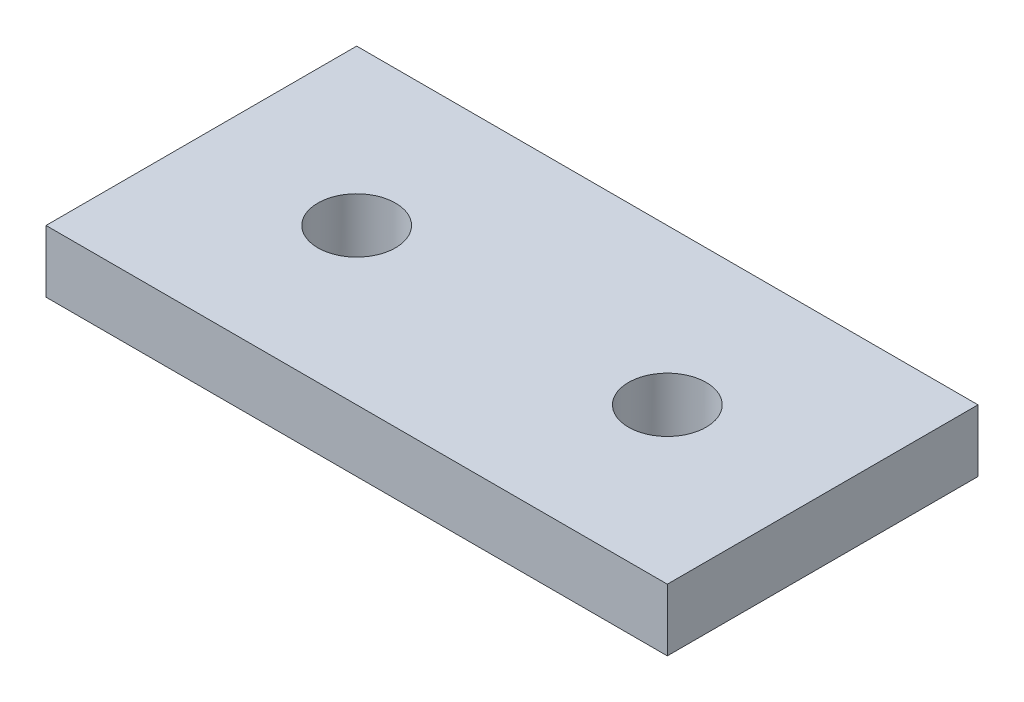
ISO-10303-21;
HEADER;
FILE_DESCRIPTION(('STEP AP214'),'2;1');
FILE_NAME('part.step','',(''),(''),'','','');
FILE_SCHEMA(('AUTOMOTIVE_DESIGN { 1 0 10303 214 1 1 1 1 }'));
ENDSEC;
DATA;
#1=APPLICATION_CONTEXT('core data for automotive mechanical design processes');
#2=APPLICATION_PROTOCOL_DEFINITION('international standard','automotive_design',2000,#1);
#3=PRODUCT_CONTEXT('',#1,'mechanical');
#4=PRODUCT('Part','Part','',(#3));
#5=PRODUCT_RELATED_PRODUCT_CATEGORY('part','',(#4));
#6=PRODUCT_DEFINITION_FORMATION('','',#4);
#7=PRODUCT_DEFINITION_CONTEXT('part definition',#1,'design');
#8=PRODUCT_DEFINITION('design','',#6,#7);
#9=PRODUCT_DEFINITION_SHAPE('','',#8);
#10=(LENGTH_UNIT() NAMED_UNIT(*) SI_UNIT(.MILLI.,.METRE.));
#11=(NAMED_UNIT(*) PLANE_ANGLE_UNIT() SI_UNIT($,.RADIAN.));
#12=(NAMED_UNIT(*) SI_UNIT($,.STERADIAN.) SOLID_ANGLE_UNIT());
#13=UNCERTAINTY_MEASURE_WITH_UNIT(LENGTH_MEASURE(1.E-05),#10,'distance_accuracy_value','');
#14=(GEOMETRIC_REPRESENTATION_CONTEXT(3) GLOBAL_UNCERTAINTY_ASSIGNED_CONTEXT((#13)) GLOBAL_UNIT_ASSIGNED_CONTEXT((#10,
#11,#12)) REPRESENTATION_CONTEXT('',''));
#15=CARTESIAN_POINT('',(0.,0.,0.));
#16=DIRECTION('',(0.,0.,1.));
#17=DIRECTION('',(1.,0.,0.));
#18=AXIS2_PLACEMENT_3D('',#15,#16,#17);
#19=CARTESIAN_POINT('',(76.2,5.08,0.));
#20=DIRECTION('',(0.,0.,-1.));
#21=DIRECTION('',(-1.,0.,0.));
#22=AXIS2_PLACEMENT_3D('',#19,#20,#21);
#23=PLANE('',#22);
#24=DIRECTION('',(1.,0.,0.));
#25=VECTOR('',#24,1.);
#26=CARTESIAN_POINT('',(76.2,5.08,0.));
#27=LINE('',#26,#25);
#28=CARTESIAN_POINT('',(25.4,5.08,0.));
#29=VERTEX_POINT('',#28);
#30=CARTESIAN_POINT('',(76.2,5.08,0.));
#31=VERTEX_POINT('',#30);
#32=EDGE_CURVE('E103',#29,#31,#27,.T.);
#33=ORIENTED_EDGE('',*,*,#32,.F.);
#34=DIRECTION('',(0.,-1.,0.));
#35=VECTOR('',#34,1.);
#36=CARTESIAN_POINT('',(25.4,5.08,0.));
#37=LINE('',#36,#35);
#38=CARTESIAN_POINT('',(25.4,0.,0.));
#39=VERTEX_POINT('',#38);
#40=EDGE_CURVE('E99',#29,#39,#37,.T.);
#41=ORIENTED_EDGE('',*,*,#40,.T.);
#42=DIRECTION('',(1.,0.,0.));
#43=VECTOR('',#42,1.);
#44=CARTESIAN_POINT('',(76.2,0.,0.));
#45=LINE('',#44,#43);
#46=CARTESIAN_POINT('',(76.2,0.,0.));
#47=VERTEX_POINT('',#46);
#48=EDGE_CURVE('E97',#39,#47,#45,.T.);
#49=ORIENTED_EDGE('',*,*,#48,.T.);
#50=DIRECTION('',(0.,-1.,0.));
#51=VECTOR('',#50,1.);
#52=CARTESIAN_POINT('',(76.2,5.08,0.));
#53=LINE('',#52,#51);
#54=EDGE_CURVE('E11',#31,#47,#53,.T.);
#55=ORIENTED_EDGE('',*,*,#54,.F.);
#56=EDGE_LOOP('',(#33,#41,#49,#55));
#57=FACE_BOUND('',#56,.T.);
#58=ADVANCED_FACE('F38',(#57),#23,.F.);
#59=CARTESIAN_POINT('',(76.2,5.08,-25.4));
#60=DIRECTION('',(-1.,0.,0.));
#61=DIRECTION('',(0.,0.,1.));
#62=AXIS2_PLACEMENT_3D('',#59,#60,#61);
#63=PLANE('',#62);
#64=DIRECTION('',(0.,0.,-1.));
#65=VECTOR('',#64,1.);
#66=CARTESIAN_POINT('',(76.2,0.,-25.4));
#67=LINE('',#66,#65);
#68=CARTESIAN_POINT('',(76.2,0.,-25.4));
#69=VERTEX_POINT('',#68);
#70=EDGE_CURVE('E69',#47,#69,#67,.T.);
#71=ORIENTED_EDGE('',*,*,#70,.T.);
#72=DIRECTION('',(0.,-1.,0.));
#73=VECTOR('',#72,1.);
#74=CARTESIAN_POINT('',(76.2,5.08,-25.4));
#75=LINE('',#74,#73);
#76=CARTESIAN_POINT('',(76.2,5.08,-25.4));
#77=VERTEX_POINT('',#76);
#78=EDGE_CURVE('E48',#77,#69,#75,.T.);
#79=ORIENTED_EDGE('',*,*,#78,.F.);
#80=DIRECTION('',(0.,0.,-1.));
#81=VECTOR('',#80,1.);
#82=CARTESIAN_POINT('',(76.2,5.08,-25.4));
#83=LINE('',#82,#81);
#84=EDGE_CURVE('E57',#31,#77,#83,.T.);
#85=ORIENTED_EDGE('',*,*,#84,.F.);
#86=ORIENTED_EDGE('',*,*,#54,.T.);
#87=EDGE_LOOP('',(#71,#79,#85,#86));
#88=FACE_BOUND('',#87,.T.);
#89=ADVANCED_FACE('F157',(#88),#63,.F.);
#90=CARTESIAN_POINT('',(25.4,5.08,-25.4));
#91=DIRECTION('',(0.,0.,1.));
#92=DIRECTION('',(1.,0.,0.));
#93=AXIS2_PLACEMENT_3D('',#90,#91,#92);
#94=PLANE('',#93);
#95=DIRECTION('',(-1.,0.,0.));
#96=VECTOR('',#95,1.);
#97=CARTESIAN_POINT('',(25.4,0.,-25.4));
#98=LINE('',#97,#96);
#99=CARTESIAN_POINT('',(25.4,0.,-25.4));
#100=VERTEX_POINT('',#99);
#101=EDGE_CURVE('E96',#69,#100,#98,.T.);
#102=ORIENTED_EDGE('',*,*,#101,.T.);
#103=DIRECTION('',(0.,-1.,0.));
#104=VECTOR('',#103,1.);
#105=CARTESIAN_POINT('',(25.4,5.08,-25.4));
#106=LINE('',#105,#104);
#107=CARTESIAN_POINT('',(25.4,5.08,-25.4));
#108=VERTEX_POINT('',#107);
#109=EDGE_CURVE('E76',#108,#100,#106,.T.);
#110=ORIENTED_EDGE('',*,*,#109,.F.);
#111=DIRECTION('',(-1.,0.,0.));
#112=VECTOR('',#111,1.);
#113=CARTESIAN_POINT('',(25.4,5.08,-25.4));
#114=LINE('',#113,#112);
#115=EDGE_CURVE('E89',#77,#108,#114,.T.);
#116=ORIENTED_EDGE('',*,*,#115,.F.);
#117=ORIENTED_EDGE('',*,*,#78,.T.);
#118=EDGE_LOOP('',(#102,#110,#116,#117));
#119=FACE_BOUND('',#118,.T.);
#120=ADVANCED_FACE('F101',(#119),#94,.F.);
#121=CARTESIAN_POINT('',(0.,5.08,0.));
#122=DIRECTION('',(0.,-1.,0.));
#123=DIRECTION('',(0.,0.,-1.));
#124=AXIS2_PLACEMENT_3D('',#121,#122,#123);
#125=PLANE('',#124);
#126=CARTESIAN_POINT('',(38.1,5.08,-12.7));
#127=DIRECTION('',(0.,1.,0.));
#128=DIRECTION('',(0.,0.,1.));
#129=AXIS2_PLACEMENT_3D('',#126,#127,#128);
#130=CIRCLE('',#129,3.175);
#131=CARTESIAN_POINT('',(38.1,5.08,-9.525));
#132=VERTEX_POINT('',#131);
#133=EDGE_CURVE('E126',#132,#132,#130,.T.);
#134=ORIENTED_EDGE('',*,*,#133,.F.);
#135=EDGE_LOOP('',(#134));
#136=FACE_BOUND('',#135,.T.);
#137=CARTESIAN_POINT('',(63.5,5.08,-12.7));
#138=DIRECTION('',(0.,1.,0.));
#139=DIRECTION('',(0.,0.,1.));
#140=AXIS2_PLACEMENT_3D('',#137,#138,#139);
#141=CIRCLE('',#140,3.175);
#142=CARTESIAN_POINT('',(63.5,5.08,-9.525));
#143=VERTEX_POINT('',#142);
#144=EDGE_CURVE('E115',#143,#143,#141,.T.);
#145=ORIENTED_EDGE('',*,*,#144,.F.);
#146=EDGE_LOOP('',(#145));
#147=FACE_BOUND('',#146,.T.);
#148=ORIENTED_EDGE('',*,*,#115,.T.);
#149=DIRECTION('',(0.,0.,-1.));
#150=VECTOR('',#149,1.);
#151=CARTESIAN_POINT('',(25.4,5.08,0.));
#152=LINE('',#151,#150);
#153=EDGE_CURVE('E84',#29,#108,#152,.T.);
#154=ORIENTED_EDGE('',*,*,#153,.F.);
#155=ORIENTED_EDGE('',*,*,#32,.T.);
#156=ORIENTED_EDGE('',*,*,#84,.T.);
#157=EDGE_LOOP('',(#148,#154,#155,#156));
#158=FACE_BOUND('',#157,.T.);
#159=ADVANCED_FACE('F132',(#136,#147,#158),#125,.F.);
#160=CARTESIAN_POINT('',(0.,0.,0.));
#161=DIRECTION('',(0.,-1.,0.));
#162=DIRECTION('',(0.,0.,-1.));
#163=AXIS2_PLACEMENT_3D('',#160,#161,#162);
#164=PLANE('',#163);
#165=DIRECTION('',(0.,0.,-1.));
#166=VECTOR('',#165,1.);
#167=CARTESIAN_POINT('',(25.4,0.,0.));
#168=LINE('',#167,#166);
#169=EDGE_CURVE('E81',#39,#100,#168,.T.);
#170=ORIENTED_EDGE('',*,*,#169,.T.);
#171=ORIENTED_EDGE('',*,*,#101,.F.);
#172=ORIENTED_EDGE('',*,*,#70,.F.);
#173=ORIENTED_EDGE('',*,*,#48,.F.);
#174=EDGE_LOOP('',(#170,#171,#172,#173));
#175=FACE_BOUND('',#174,.T.);
#176=CARTESIAN_POINT('',(38.1,0.,-12.7));
#177=DIRECTION('',(0.,-1.,0.));
#178=DIRECTION('',(0.,0.,-1.));
#179=AXIS2_PLACEMENT_3D('',#176,#177,#178);
#180=CIRCLE('',#179,3.175);
#181=CARTESIAN_POINT('',(38.1,0.,-15.875));
#182=VERTEX_POINT('',#181);
#183=EDGE_CURVE('E41',#182,#182,#180,.T.);
#184=ORIENTED_EDGE('',*,*,#183,.F.);
#185=EDGE_LOOP('',(#184));
#186=FACE_BOUND('',#185,.T.);
#187=CARTESIAN_POINT('',(63.5,0.,-12.7));
#188=DIRECTION('',(0.,-1.,0.));
#189=DIRECTION('',(0.,0.,-1.));
#190=AXIS2_PLACEMENT_3D('',#187,#188,#189);
#191=CIRCLE('',#190,3.175);
#192=CARTESIAN_POINT('',(63.5,0.,-15.875));
#193=VERTEX_POINT('',#192);
#194=EDGE_CURVE('E112',#193,#193,#191,.T.);
#195=ORIENTED_EDGE('',*,*,#194,.F.);
#196=EDGE_LOOP('',(#195));
#197=FACE_BOUND('',#196,.T.);
#198=ADVANCED_FACE('F94',(#175,#186,#197),#164,.T.);
#199=CARTESIAN_POINT('',(63.5,5.08,-12.7));
#200=DIRECTION('',(0.,1.,0.));
#201=DIRECTION('',(0.,0.,1.));
#202=AXIS2_PLACEMENT_3D('',#199,#200,#201);
#203=CYLINDRICAL_SURFACE('',#202,3.175);
#204=ORIENTED_EDGE('',*,*,#194,.T.);
#205=EDGE_LOOP('',(#204));
#206=FACE_BOUND('',#205,.T.);
#207=ORIENTED_EDGE('',*,*,#144,.T.);
#208=EDGE_LOOP('',(#207));
#209=FACE_BOUND('',#208,.T.);
#210=ADVANCED_FACE('F155',(#206,#209),#203,.F.);
#211=CARTESIAN_POINT('',(38.1,5.08,-12.7));
#212=DIRECTION('',(0.,1.,0.));
#213=DIRECTION('',(0.,0.,1.));
#214=AXIS2_PLACEMENT_3D('',#211,#212,#213);
#215=CYLINDRICAL_SURFACE('',#214,3.175);
#216=ORIENTED_EDGE('',*,*,#183,.T.);
#217=EDGE_LOOP('',(#216));
#218=FACE_BOUND('',#217,.T.);
#219=ORIENTED_EDGE('',*,*,#133,.T.);
#220=EDGE_LOOP('',(#219));
#221=FACE_BOUND('',#220,.T.);
#222=ADVANCED_FACE('F146',(#218,#221),#215,.F.);
#223=CARTESIAN_POINT('',(25.4,5.08,0.));
#224=DIRECTION('',(1.,0.,0.));
#225=DIRECTION('',(0.,0.,-1.));
#226=AXIS2_PLACEMENT_3D('',#223,#224,#225);
#227=PLANE('',#226);
#228=ORIENTED_EDGE('',*,*,#169,.F.);
#229=ORIENTED_EDGE('',*,*,#40,.F.);
#230=ORIENTED_EDGE('',*,*,#153,.T.);
#231=ORIENTED_EDGE('',*,*,#109,.T.);
#232=EDGE_LOOP('',(#228,#229,#230,#231));
#233=FACE_BOUND('',#232,.T.);
#234=ADVANCED_FACE('F78',(#233),#227,.F.);
#235=CLOSED_SHELL('',(#58,#89,#120,#159,#198,#210,#222,#234));
#236=MANIFOLD_SOLID_BREP('B2',#235);
#237=ADVANCED_BREP_SHAPE_REPRESENTATION('',(#18,#236),#14);
#238=SHAPE_DEFINITION_REPRESENTATION(#9,#237);
ENDSEC;
END-ISO-10303-21;
